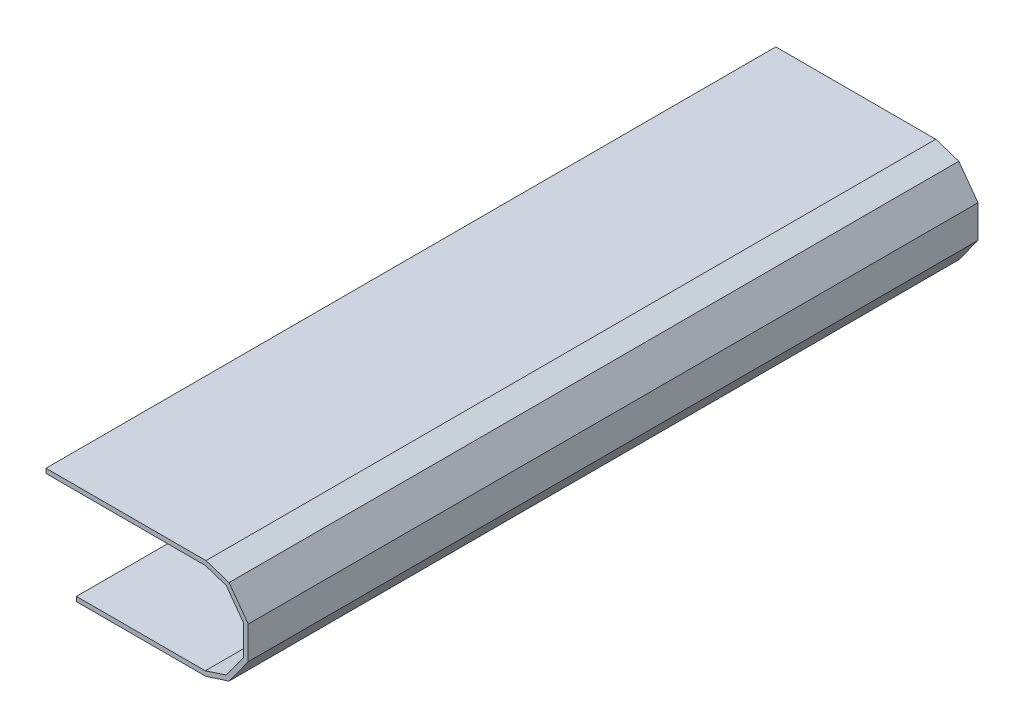
ISO-10303-21;
HEADER;
FILE_DESCRIPTION(('STEP AP214'),'2;1');
FILE_NAME('part.step','',(''),(''),'','','');
FILE_SCHEMA(('AUTOMOTIVE_DESIGN { 1 0 10303 214 1 1 1 1 }'));
ENDSEC;
DATA;
#1=APPLICATION_CONTEXT('core data for automotive mechanical design processes');
#2=APPLICATION_PROTOCOL_DEFINITION('international standard','automotive_design',2000,#1);
#3=PRODUCT_CONTEXT('',#1,'mechanical');
#4=PRODUCT('Part','Part','',(#3));
#5=PRODUCT_RELATED_PRODUCT_CATEGORY('part','',(#4));
#6=PRODUCT_DEFINITION_FORMATION('','',#4);
#7=PRODUCT_DEFINITION_CONTEXT('part definition',#1,'design');
#8=PRODUCT_DEFINITION('design','',#6,#7);
#9=PRODUCT_DEFINITION_SHAPE('','',#8);
#10=(LENGTH_UNIT() NAMED_UNIT(*) SI_UNIT(.MILLI.,.METRE.));
#11=(NAMED_UNIT(*) PLANE_ANGLE_UNIT() SI_UNIT($,.RADIAN.));
#12=(NAMED_UNIT(*) SI_UNIT($,.STERADIAN.) SOLID_ANGLE_UNIT());
#13=UNCERTAINTY_MEASURE_WITH_UNIT(LENGTH_MEASURE(1.E-05),#10,'distance_accuracy_value','');
#14=(GEOMETRIC_REPRESENTATION_CONTEXT(3) GLOBAL_UNCERTAINTY_ASSIGNED_CONTEXT((#13)) GLOBAL_UNIT_ASSIGNED_CONTEXT((#10,
#11,#12)) REPRESENTATION_CONTEXT('',''));
#15=CARTESIAN_POINT('',(0.,0.,0.));
#16=DIRECTION('',(0.,0.,1.));
#17=DIRECTION('',(1.,0.,0.));
#18=AXIS2_PLACEMENT_3D('',#15,#16,#17);
#19=CARTESIAN_POINT('',(-80.,-30.,480.));
#20=DIRECTION('',(1.,0.,0.));
#21=DIRECTION('',(0.,0.,-1.));
#22=AXIS2_PLACEMENT_3D('',#19,#20,#21);
#23=PLANE('',#22);
#24=DIRECTION('',(0.,-1.,0.));
#25=VECTOR('',#24,1.);
#26=CARTESIAN_POINT('',(-80.,-30.,0.));
#27=LINE('',#26,#25);
#28=CARTESIAN_POINT('',(-80.,-30.,0.));
#29=VERTEX_POINT('',#28);
#30=CARTESIAN_POINT('',(-80.,-33.,0.));
#31=VERTEX_POINT('',#30);
#32=EDGE_CURVE('E169',#29,#31,#27,.T.);
#33=ORIENTED_EDGE('',*,*,#32,.T.);
#34=DIRECTION('',(0.,0.,-1.));
#35=VECTOR('',#34,1.);
#36=CARTESIAN_POINT('',(-80.,-33.,480.));
#37=LINE('',#36,#35);
#38=CARTESIAN_POINT('',(-80.,-33.,480.));
#39=VERTEX_POINT('',#38);
#40=EDGE_CURVE('E11',#39,#31,#37,.T.);
#41=ORIENTED_EDGE('',*,*,#40,.F.);
#42=DIRECTION('',(0.,-1.,0.));
#43=VECTOR('',#42,1.);
#44=CARTESIAN_POINT('',(-80.,-30.,480.));
#45=LINE('',#44,#43);
#46=CARTESIAN_POINT('',(-80.,-30.,480.));
#47=VERTEX_POINT('',#46);
#48=EDGE_CURVE('E201',#47,#39,#45,.T.);
#49=ORIENTED_EDGE('',*,*,#48,.F.);
#50=DIRECTION('',(0.,0.,-1.));
#51=VECTOR('',#50,1.);
#52=CARTESIAN_POINT('',(-80.,-30.,480.));
#53=LINE('',#52,#51);
#54=EDGE_CURVE('E165',#47,#29,#53,.T.);
#55=ORIENTED_EDGE('',*,*,#54,.T.);
#56=EDGE_LOOP('',(#33,#41,#49,#55));
#57=FACE_BOUND('',#56,.T.);
#58=ADVANCED_FACE('F33',(#57),#23,.F.);
#59=CARTESIAN_POINT('',(0.,-33.,480.));
#60=DIRECTION('',(0.,1.,0.));
#61=DIRECTION('',(-1.,0.,0.));
#62=AXIS2_PLACEMENT_3D('',#59,#60,#61);
#63=PLANE('',#62);
#64=DIRECTION('',(1.,0.,0.));
#65=VECTOR('',#64,1.);
#66=CARTESIAN_POINT('',(0.,-33.,0.));
#67=LINE('',#66,#65);
#68=CARTESIAN_POINT('',(5.22668653071022,-32.9999999999999,0.));
#69=VERTEX_POINT('',#68);
#70=EDGE_CURVE('E172',#31,#69,#67,.T.);
#71=ORIENTED_EDGE('',*,*,#70,.T.);
#72=DIRECTION('',(0.,0.,-1.));
#73=VECTOR('',#72,1.);
#74=CARTESIAN_POINT('',(5.22668653071022,-32.9999999999999,480.));
#75=LINE('',#74,#73);
#76=CARTESIAN_POINT('',(5.22668653071022,-32.9999999999999,480.));
#77=VERTEX_POINT('',#76);
#78=EDGE_CURVE('E41',#77,#69,#75,.T.);
#79=ORIENTED_EDGE('',*,*,#78,.F.);
#80=DIRECTION('',(1.,0.,0.));
#81=VECTOR('',#80,1.);
#82=CARTESIAN_POINT('',(-80.,-33.,480.));
#83=LINE('',#82,#81);
#84=EDGE_CURVE('E109',#39,#77,#83,.T.);
#85=ORIENTED_EDGE('',*,*,#84,.F.);
#86=ORIENTED_EDGE('',*,*,#40,.T.);
#87=EDGE_LOOP('',(#71,#79,#85,#86));
#88=FACE_BOUND('',#87,.T.);
#89=ADVANCED_FACE('F330',(#88),#63,.F.);
#90=CARTESIAN_POINT('',(5.22668653071022,-32.9999999999999,480.));
#91=DIRECTION('',(-0.309016994374947,0.951056516295154,0.));
#92=DIRECTION('',(-0.951056516295154,-0.309016994374947,0.));
#93=AXIS2_PLACEMENT_3D('',#90,#91,#92);
#94=PLANE('',#93);
#95=DIRECTION('',(0.951056516295154,0.309016994374947,0.));
#96=VECTOR('',#95,1.);
#97=CARTESIAN_POINT('',(5.22668653071022,-32.9999999999999,0.));
#98=LINE('',#97,#96);
#99=CARTESIAN_POINT('',(20.3951216287466,-28.0714766756174,0.));
#100=VERTEX_POINT('',#99);
#101=EDGE_CURVE('E175',#69,#100,#98,.T.);
#102=ORIENTED_EDGE('',*,*,#101,.T.);
#103=DIRECTION('',(0.,0.,-1.));
#104=VECTOR('',#103,1.);
#105=CARTESIAN_POINT('',(20.3951216287466,-28.0714766756174,480.));
#106=LINE('',#105,#104);
#107=CARTESIAN_POINT('',(20.3951216287466,-28.0714766756174,480.));
#108=VERTEX_POINT('',#107);
#109=EDGE_CURVE('E226',#108,#100,#106,.T.);
#110=ORIENTED_EDGE('',*,*,#109,.F.);
#111=DIRECTION('',(0.951056516295154,0.309016994374947,0.));
#112=VECTOR('',#111,1.);
#113=CARTESIAN_POINT('',(5.22668653071022,-32.9999999999999,480.));
#114=LINE('',#113,#112);
#115=EDGE_CURVE('E234',#77,#108,#114,.T.);
#116=ORIENTED_EDGE('',*,*,#115,.F.);
#117=ORIENTED_EDGE('',*,*,#78,.T.);
#118=EDGE_LOOP('',(#102,#110,#116,#117));
#119=FACE_BOUND('',#118,.T.);
#120=ADVANCED_FACE('F232',(#119),#94,.F.);
#121=CARTESIAN_POINT('',(20.3951216287466,-28.0714766756174,480.));
#122=DIRECTION('',(-0.809016994374947,0.587785252292473,0.));
#123=DIRECTION('',(-0.587785252292473,-0.809016994374947,0.));
#124=AXIS2_PLACEMENT_3D('',#121,#122,#123);
#125=PLANE('',#124);
#126=DIRECTION('',(0.587785252292473,0.809016994374947,0.));
#127=VECTOR('',#126,1.);
#128=CARTESIAN_POINT('',(20.3951216287466,-28.0714766756174,0.));
#129=LINE('',#128,#127);
#130=CARTESIAN_POINT('',(33.0000000000001,-10.7223499756859,0.));
#131=VERTEX_POINT('',#130);
#132=EDGE_CURVE('E177',#100,#131,#129,.T.);
#133=ORIENTED_EDGE('',*,*,#132,.T.);
#134=DIRECTION('',(0.,0.,-1.));
#135=VECTOR('',#134,1.);
#136=CARTESIAN_POINT('',(33.0000000000001,-10.7223499756859,480.));
#137=LINE('',#136,#135);
#138=CARTESIAN_POINT('',(33.0000000000001,-10.7223499756859,480.));
#139=VERTEX_POINT('',#138);
#140=EDGE_CURVE('E223',#139,#131,#137,.T.);
#141=ORIENTED_EDGE('',*,*,#140,.F.);
#142=DIRECTION('',(0.587785252292473,0.809016994374947,0.));
#143=VECTOR('',#142,1.);
#144=CARTESIAN_POINT('',(20.3951216287466,-28.0714766756174,480.));
#145=LINE('',#144,#143);
#146=EDGE_CURVE('E250',#108,#139,#145,.T.);
#147=ORIENTED_EDGE('',*,*,#146,.F.);
#148=ORIENTED_EDGE('',*,*,#109,.T.);
#149=EDGE_LOOP('',(#133,#141,#147,#148));
#150=FACE_BOUND('',#149,.T.);
#151=ADVANCED_FACE('F241',(#150),#125,.F.);
#152=CARTESIAN_POINT('',(33.0000000000001,-10.7223499756859,480.));
#153=DIRECTION('',(-1.,0.,0.));
#154=DIRECTION('',(0.,0.,1.));
#155=AXIS2_PLACEMENT_3D('',#152,#153,#154);
#156=PLANE('',#155);
#157=DIRECTION('',(0.,1.,0.));
#158=VECTOR('',#157,1.);
#159=CARTESIAN_POINT('',(33.0000000000001,-10.7223499756859,0.));
#160=LINE('',#159,#158);
#161=CARTESIAN_POINT('',(33.0000000000001,10.7223499756859,0.));
#162=VERTEX_POINT('',#161);
#163=EDGE_CURVE('E179',#131,#162,#160,.T.);
#164=ORIENTED_EDGE('',*,*,#163,.T.);
#165=DIRECTION('',(0.,0.,-1.));
#166=VECTOR('',#165,1.);
#167=CARTESIAN_POINT('',(33.0000000000001,10.7223499756859,480.));
#168=LINE('',#167,#166);
#169=CARTESIAN_POINT('',(33.0000000000001,10.7223499756859,480.));
#170=VERTEX_POINT('',#169);
#171=EDGE_CURVE('E220',#170,#162,#168,.T.);
#172=ORIENTED_EDGE('',*,*,#171,.F.);
#173=DIRECTION('',(0.,1.,0.));
#174=VECTOR('',#173,1.);
#175=CARTESIAN_POINT('',(33.0000000000001,-10.7223499756859,480.));
#176=LINE('',#175,#174);
#177=EDGE_CURVE('E247',#139,#170,#176,.T.);
#178=ORIENTED_EDGE('',*,*,#177,.F.);
#179=ORIENTED_EDGE('',*,*,#140,.T.);
#180=EDGE_LOOP('',(#164,#172,#178,#179));
#181=FACE_BOUND('',#180,.T.);
#182=ADVANCED_FACE('F245',(#181),#156,.F.);
#183=CARTESIAN_POINT('',(33.0000000000001,10.7223499756859,480.));
#184=DIRECTION('',(-0.809016994374946,-0.587785252292475,0.));
#185=DIRECTION('',(0.587785252292475,-0.809016994374946,0.));
#186=AXIS2_PLACEMENT_3D('',#183,#184,#185);
#187=PLANE('',#186);
#188=DIRECTION('',(-0.587785252292475,0.809016994374946,0.));
#189=VECTOR('',#188,1.);
#190=CARTESIAN_POINT('',(33.0000000000001,10.7223499756859,0.));
#191=LINE('',#190,#189);
#192=CARTESIAN_POINT('',(20.3951216287466,28.0714766756174,0.));
#193=VERTEX_POINT('',#192);
#194=EDGE_CURVE('E181',#162,#193,#191,.T.);
#195=ORIENTED_EDGE('',*,*,#194,.T.);
#196=DIRECTION('',(0.,0.,-1.));
#197=VECTOR('',#196,1.);
#198=CARTESIAN_POINT('',(20.3951216287466,28.0714766756174,480.));
#199=LINE('',#198,#197);
#200=CARTESIAN_POINT('',(20.3951216287466,28.0714766756174,480.));
#201=VERTEX_POINT('',#200);
#202=EDGE_CURVE('E217',#201,#193,#199,.T.);
#203=ORIENTED_EDGE('',*,*,#202,.F.);
#204=DIRECTION('',(-0.587785252292475,0.809016994374946,0.));
#205=VECTOR('',#204,1.);
#206=CARTESIAN_POINT('',(33.0000000000001,10.7223499756859,480.));
#207=LINE('',#206,#205);
#208=EDGE_CURVE('E249',#170,#201,#207,.T.);
#209=ORIENTED_EDGE('',*,*,#208,.F.);
#210=ORIENTED_EDGE('',*,*,#171,.T.);
#211=EDGE_LOOP('',(#195,#203,#209,#210));
#212=FACE_BOUND('',#211,.T.);
#213=ADVANCED_FACE('F320',(#212),#187,.F.);
#214=CARTESIAN_POINT('',(20.3951216287466,28.0714766756174,480.));
#215=DIRECTION('',(-0.309016994374947,-0.951056516295154,0.));
#216=DIRECTION('',(0.951056516295154,-0.309016994374947,0.));
#217=AXIS2_PLACEMENT_3D('',#214,#215,#216);
#218=PLANE('',#217);
#219=DIRECTION('',(-0.951056516295154,0.309016994374947,0.));
#220=VECTOR('',#219,1.);
#221=CARTESIAN_POINT('',(20.3951216287466,28.0714766756174,0.));
#222=LINE('',#221,#220);
#223=CARTESIAN_POINT('',(5.22668653070951,33.0000000000001,0.));
#224=VERTEX_POINT('',#223);
#225=EDGE_CURVE('E183',#193,#224,#222,.T.);
#226=ORIENTED_EDGE('',*,*,#225,.T.);
#227=DIRECTION('',(0.,0.,-1.));
#228=VECTOR('',#227,1.);
#229=CARTESIAN_POINT('',(5.22668653070951,33.0000000000001,480.));
#230=LINE('',#229,#228);
#231=CARTESIAN_POINT('',(5.22668653070951,33.0000000000001,480.));
#232=VERTEX_POINT('',#231);
#233=EDGE_CURVE('E214',#232,#224,#230,.T.);
#234=ORIENTED_EDGE('',*,*,#233,.F.);
#235=DIRECTION('',(-0.951056516295154,0.309016994374947,0.));
#236=VECTOR('',#235,1.);
#237=CARTESIAN_POINT('',(20.3951216287466,28.0714766756174,480.));
#238=LINE('',#237,#236);
#239=EDGE_CURVE('E252',#201,#232,#238,.T.);
#240=ORIENTED_EDGE('',*,*,#239,.F.);
#241=ORIENTED_EDGE('',*,*,#202,.T.);
#242=EDGE_LOOP('',(#226,#234,#240,#241));
#243=FACE_BOUND('',#242,.T.);
#244=ADVANCED_FACE('F317',(#243),#218,.F.);
#245=CARTESIAN_POINT('',(0.,33.0000000000001,480.));
#246=DIRECTION('',(0.,-1.,0.));
#247=DIRECTION('',(0.,0.,-1.));
#248=AXIS2_PLACEMENT_3D('',#245,#246,#247);
#249=PLANE('',#248);
#250=DIRECTION('',(-1.,0.,0.));
#251=VECTOR('',#250,1.);
#252=CARTESIAN_POINT('',(0.,33.0000000000001,0.));
#253=LINE('',#252,#251);
#254=CARTESIAN_POINT('',(-100.,33.0000000000001,0.));
#255=VERTEX_POINT('',#254);
#256=EDGE_CURVE('E186',#224,#255,#253,.T.);
#257=ORIENTED_EDGE('',*,*,#256,.T.);
#258=DIRECTION('',(0.,0.,-1.));
#259=VECTOR('',#258,1.);
#260=CARTESIAN_POINT('',(-100.,33.0000000000001,0.));
#261=LINE('',#260,#259);
#262=CARTESIAN_POINT('',(-100.,33.0000000000001,480.));
#263=VERTEX_POINT('',#262);
#264=EDGE_CURVE('E173',#263,#255,#261,.T.);
#265=ORIENTED_EDGE('',*,*,#264,.F.);
#266=DIRECTION('',(-1.,0.,0.));
#267=VECTOR('',#266,1.);
#268=CARTESIAN_POINT('',(0.,33.0000000000001,480.));
#269=LINE('',#268,#267);
#270=EDGE_CURVE('E258',#232,#263,#269,.T.);
#271=ORIENTED_EDGE('',*,*,#270,.F.);
#272=ORIENTED_EDGE('',*,*,#233,.T.);
#273=EDGE_LOOP('',(#257,#265,#271,#272));
#274=FACE_BOUND('',#273,.T.);
#275=ADVANCED_FACE('F313',(#274),#249,.F.);
#276=CARTESIAN_POINT('',(0.,30.0000000000001,480.));
#277=DIRECTION('',(0.,1.,0.));
#278=DIRECTION('',(-1.,0.,0.));
#279=AXIS2_PLACEMENT_3D('',#276,#277,#278);
#280=PLANE('',#279);
#281=DIRECTION('',(1.,0.,0.));
#282=VECTOR('',#281,1.);
#283=CARTESIAN_POINT('',(0.,30.0000000000001,0.));
#284=LINE('',#283,#282);
#285=CARTESIAN_POINT('',(-100.,30.0000000000001,0.));
#286=VERTEX_POINT('',#285);
#287=CARTESIAN_POINT('',(4.7515332097361,30.,0.));
#288=VERTEX_POINT('',#287);
#289=EDGE_CURVE('E189',#286,#288,#284,.T.);
#290=ORIENTED_EDGE('',*,*,#289,.T.);
#291=DIRECTION('',(0.,0.,-1.));
#292=VECTOR('',#291,1.);
#293=CARTESIAN_POINT('',(4.7515332097361,30.,480.));
#294=LINE('',#293,#292);
#295=CARTESIAN_POINT('',(4.7515332097361,30.,480.));
#296=VERTEX_POINT('',#295);
#297=EDGE_CURVE('E211',#296,#288,#294,.T.);
#298=ORIENTED_EDGE('',*,*,#297,.F.);
#299=DIRECTION('',(1.,0.,0.));
#300=VECTOR('',#299,1.);
#301=CARTESIAN_POINT('',(0.,30.0000000000001,480.));
#302=LINE('',#301,#300);
#303=CARTESIAN_POINT('',(-100.,30.0000000000001,480.));
#304=VERTEX_POINT('',#303);
#305=EDGE_CURVE('E261',#304,#296,#302,.T.);
#306=ORIENTED_EDGE('',*,*,#305,.F.);
#307=DIRECTION('',(0.,0.,1.));
#308=VECTOR('',#307,1.);
#309=CARTESIAN_POINT('',(-100.,30.0000000000001,0.));
#310=LINE('',#309,#308);
#311=EDGE_CURVE('E288',#286,#304,#310,.T.);
#312=ORIENTED_EDGE('',*,*,#311,.F.);
#313=EDGE_LOOP('',(#290,#298,#306,#312));
#314=FACE_BOUND('',#313,.T.);
#315=ADVANCED_FACE('F312',(#314),#280,.F.);
#316=CARTESIAN_POINT('',(18.5410196624969,25.5195242505612,480.));
#317=DIRECTION('',(0.309016994374947,0.951056516295154,0.));
#318=DIRECTION('',(-0.951056516295154,0.309016994374947,0.));
#319=AXIS2_PLACEMENT_3D('',#316,#317,#318);
#320=PLANE('',#319);
#321=DIRECTION('',(0.951056516295154,-0.309016994374947,0.));
#322=VECTOR('',#321,1.);
#323=CARTESIAN_POINT('',(18.5410196624969,25.5195242505612,0.));
#324=LINE('',#323,#322);
#325=CARTESIAN_POINT('',(18.5410196624969,25.5195242505612,0.));
#326=VERTEX_POINT('',#325);
#327=EDGE_CURVE('E191',#288,#326,#324,.T.);
#328=ORIENTED_EDGE('',*,*,#327,.T.);
#329=DIRECTION('',(0.,0.,-1.));
#330=VECTOR('',#329,1.);
#331=CARTESIAN_POINT('',(18.5410196624969,25.5195242505612,480.));
#332=LINE('',#331,#330);
#333=CARTESIAN_POINT('',(18.5410196624969,25.5195242505612,480.));
#334=VERTEX_POINT('',#333);
#335=EDGE_CURVE('E208',#334,#326,#332,.T.);
#336=ORIENTED_EDGE('',*,*,#335,.F.);
#337=DIRECTION('',(0.951056516295154,-0.309016994374947,0.));
#338=VECTOR('',#337,1.);
#339=CARTESIAN_POINT('',(18.5410196624969,25.5195242505612,480.));
#340=LINE('',#339,#338);
#341=EDGE_CURVE('E263',#296,#334,#340,.T.);
#342=ORIENTED_EDGE('',*,*,#341,.F.);
#343=ORIENTED_EDGE('',*,*,#297,.T.);
#344=EDGE_LOOP('',(#328,#336,#342,#343));
#345=FACE_BOUND('',#344,.T.);
#346=ADVANCED_FACE('F365',(#345),#320,.F.);
#347=CARTESIAN_POINT('',(30.0000000000001,9.74759088698721,480.));
#348=DIRECTION('',(0.809016994374946,0.587785252292475,0.));
#349=DIRECTION('',(-0.587785252292475,0.809016994374946,0.));
#350=AXIS2_PLACEMENT_3D('',#347,#348,#349);
#351=PLANE('',#350);
#352=DIRECTION('',(0.587785252292475,-0.809016994374946,0.));
#353=VECTOR('',#352,1.);
#354=CARTESIAN_POINT('',(30.0000000000001,9.74759088698721,0.));
#355=LINE('',#354,#353);
#356=CARTESIAN_POINT('',(30.0000000000001,9.74759088698721,0.));
#357=VERTEX_POINT('',#356);
#358=EDGE_CURVE('E193',#326,#357,#355,.T.);
#359=ORIENTED_EDGE('',*,*,#358,.T.);
#360=DIRECTION('',(0.,0.,-1.));
#361=VECTOR('',#360,1.);
#362=CARTESIAN_POINT('',(30.0000000000001,9.74759088698721,480.));
#363=LINE('',#362,#361);
#364=CARTESIAN_POINT('',(30.0000000000001,9.74759088698721,480.));
#365=VERTEX_POINT('',#364);
#366=EDGE_CURVE('E205',#365,#357,#363,.T.);
#367=ORIENTED_EDGE('',*,*,#366,.F.);
#368=DIRECTION('',(0.587785252292475,-0.809016994374946,0.));
#369=VECTOR('',#368,1.);
#370=CARTESIAN_POINT('',(30.0000000000001,9.74759088698721,480.));
#371=LINE('',#370,#369);
#372=EDGE_CURVE('E265',#334,#365,#371,.T.);
#373=ORIENTED_EDGE('',*,*,#372,.F.);
#374=ORIENTED_EDGE('',*,*,#335,.T.);
#375=EDGE_LOOP('',(#359,#367,#373,#374));
#376=FACE_BOUND('',#375,.T.);
#377=ADVANCED_FACE('F271',(#376),#351,.F.);
#378=CARTESIAN_POINT('',(30.0000000000001,-9.74759088698722,480.));
#379=DIRECTION('',(1.,0.,0.));
#380=DIRECTION('',(0.,1.,0.));
#381=AXIS2_PLACEMENT_3D('',#378,#379,#380);
#382=PLANE('',#381);
#383=DIRECTION('',(0.,-1.,0.));
#384=VECTOR('',#383,1.);
#385=CARTESIAN_POINT('',(30.0000000000001,-9.74759088698722,0.));
#386=LINE('',#385,#384);
#387=CARTESIAN_POINT('',(30.0000000000001,-9.74759088698722,0.));
#388=VERTEX_POINT('',#387);
#389=EDGE_CURVE('E195',#357,#388,#386,.T.);
#390=ORIENTED_EDGE('',*,*,#389,.T.);
#391=DIRECTION('',(0.,0.,-1.));
#392=VECTOR('',#391,1.);
#393=CARTESIAN_POINT('',(30.0000000000001,-9.74759088698722,480.));
#394=LINE('',#393,#392);
#395=CARTESIAN_POINT('',(30.0000000000001,-9.74759088698722,480.));
#396=VERTEX_POINT('',#395);
#397=EDGE_CURVE('E160',#396,#388,#394,.T.);
#398=ORIENTED_EDGE('',*,*,#397,.F.);
#399=DIRECTION('',(0.,-1.,0.));
#400=VECTOR('',#399,1.);
#401=CARTESIAN_POINT('',(30.0000000000001,-9.74759088698722,480.));
#402=LINE('',#401,#400);
#403=EDGE_CURVE('E149',#365,#396,#402,.T.);
#404=ORIENTED_EDGE('',*,*,#403,.F.);
#405=ORIENTED_EDGE('',*,*,#366,.T.);
#406=EDGE_LOOP('',(#390,#398,#404,#405));
#407=FACE_BOUND('',#406,.T.);
#408=ADVANCED_FACE('F275',(#407),#382,.F.);
#409=CARTESIAN_POINT('',(18.5410196624969,-25.5195242505613,480.));
#410=DIRECTION('',(0.809016994374947,-0.587785252292473,0.));
#411=DIRECTION('',(0.587785252292473,0.809016994374947,0.));
#412=AXIS2_PLACEMENT_3D('',#409,#410,#411);
#413=PLANE('',#412);
#414=DIRECTION('',(-0.587785252292473,-0.809016994374947,0.));
#415=VECTOR('',#414,1.);
#416=CARTESIAN_POINT('',(18.5410196624969,-25.5195242505613,0.));
#417=LINE('',#416,#415);
#418=CARTESIAN_POINT('',(18.5410196624969,-25.5195242505613,0.));
#419=VERTEX_POINT('',#418);
#420=EDGE_CURVE('E158',#388,#419,#417,.T.);
#421=ORIENTED_EDGE('',*,*,#420,.T.);
#422=DIRECTION('',(0.,0.,-1.));
#423=VECTOR('',#422,1.);
#424=CARTESIAN_POINT('',(18.5410196624969,-25.5195242505613,480.));
#425=LINE('',#424,#423);
#426=CARTESIAN_POINT('',(18.5410196624969,-25.5195242505613,480.));
#427=VERTEX_POINT('',#426);
#428=EDGE_CURVE('E155',#427,#419,#425,.T.);
#429=ORIENTED_EDGE('',*,*,#428,.F.);
#430=DIRECTION('',(-0.587785252292473,-0.809016994374947,0.));
#431=VECTOR('',#430,1.);
#432=CARTESIAN_POINT('',(18.5410196624969,-25.5195242505613,480.));
#433=LINE('',#432,#431);
#434=EDGE_CURVE('E142',#396,#427,#433,.T.);
#435=ORIENTED_EDGE('',*,*,#434,.F.);
#436=ORIENTED_EDGE('',*,*,#397,.T.);
#437=EDGE_LOOP('',(#421,#429,#435,#436));
#438=FACE_BOUND('',#437,.T.);
#439=ADVANCED_FACE('F156',(#438),#413,.F.);
#440=CARTESIAN_POINT('',(4.75153320973662,-29.9999999999999,480.));
#441=DIRECTION('',(0.309016994374947,-0.951056516295154,0.));
#442=DIRECTION('',(0.951056516295154,0.309016994374947,0.));
#443=AXIS2_PLACEMENT_3D('',#440,#441,#442);
#444=PLANE('',#443);
#445=DIRECTION('',(-0.951056516295154,-0.309016994374947,0.));
#446=VECTOR('',#445,1.);
#447=CARTESIAN_POINT('',(4.75153320973662,-29.9999999999999,0.));
#448=LINE('',#447,#446);
#449=CARTESIAN_POINT('',(4.75153320973662,-29.9999999999999,0.));
#450=VERTEX_POINT('',#449);
#451=EDGE_CURVE('E198',#419,#450,#448,.T.);
#452=ORIENTED_EDGE('',*,*,#451,.T.);
#453=DIRECTION('',(0.,0.,-1.));
#454=VECTOR('',#453,1.);
#455=CARTESIAN_POINT('',(4.75153320973662,-29.9999999999999,480.));
#456=LINE('',#455,#454);
#457=CARTESIAN_POINT('',(4.75153320973662,-29.9999999999999,480.));
#458=VERTEX_POINT('',#457);
#459=EDGE_CURVE('E161',#458,#450,#456,.T.);
#460=ORIENTED_EDGE('',*,*,#459,.F.);
#461=DIRECTION('',(-0.951056516295154,-0.309016994374947,0.));
#462=VECTOR('',#461,1.);
#463=CARTESIAN_POINT('',(4.75153320973662,-29.9999999999999,480.));
#464=LINE('',#463,#462);
#465=EDGE_CURVE('E146',#427,#458,#464,.T.);
#466=ORIENTED_EDGE('',*,*,#465,.F.);
#467=ORIENTED_EDGE('',*,*,#428,.T.);
#468=EDGE_LOOP('',(#452,#460,#466,#467));
#469=FACE_BOUND('',#468,.T.);
#470=ADVANCED_FACE('F163',(#469),#444,.F.);
#471=CARTESIAN_POINT('',(-80.,-30.,480.));
#472=DIRECTION('',(0.,-1.,0.));
#473=DIRECTION('',(1.,0.,0.));
#474=AXIS2_PLACEMENT_3D('',#471,#472,#473);
#475=PLANE('',#474);
#476=DIRECTION('',(-1.,0.,0.));
#477=VECTOR('',#476,1.);
#478=CARTESIAN_POINT('',(-80.,-30.,0.));
#479=LINE('',#478,#477);
#480=EDGE_CURVE('E97',#450,#29,#479,.T.);
#481=ORIENTED_EDGE('',*,*,#480,.T.);
#482=ORIENTED_EDGE('',*,*,#54,.F.);
#483=DIRECTION('',(-1.,0.,0.));
#484=VECTOR('',#483,1.);
#485=CARTESIAN_POINT('',(0.,-29.9999999999999,480.));
#486=LINE('',#485,#484);
#487=EDGE_CURVE('E49',#458,#47,#486,.T.);
#488=ORIENTED_EDGE('',*,*,#487,.F.);
#489=ORIENTED_EDGE('',*,*,#459,.T.);
#490=EDGE_LOOP('',(#481,#482,#488,#489));
#491=FACE_BOUND('',#490,.T.);
#492=ADVANCED_FACE('F276',(#491),#475,.F.);
#493=CARTESIAN_POINT('',(0.,0.,480.));
#494=DIRECTION('',(0.,0.,1.));
#495=DIRECTION('',(1.,0.,0.));
#496=AXIS2_PLACEMENT_3D('',#493,#494,#495);
#497=PLANE('',#496);
#498=ORIENTED_EDGE('',*,*,#48,.T.);
#499=ORIENTED_EDGE('',*,*,#84,.T.);
#500=ORIENTED_EDGE('',*,*,#115,.T.);
#501=ORIENTED_EDGE('',*,*,#146,.T.);
#502=ORIENTED_EDGE('',*,*,#177,.T.);
#503=ORIENTED_EDGE('',*,*,#208,.T.);
#504=ORIENTED_EDGE('',*,*,#239,.T.);
#505=ORIENTED_EDGE('',*,*,#270,.T.);
#506=DIRECTION('',(0.,1.,0.));
#507=VECTOR('',#506,1.);
#508=CARTESIAN_POINT('',(-100.,30.0000000000001,480.));
#509=LINE('',#508,#507);
#510=EDGE_CURVE('E285',#304,#263,#509,.T.);
#511=ORIENTED_EDGE('',*,*,#510,.F.);
#512=ORIENTED_EDGE('',*,*,#305,.T.);
#513=ORIENTED_EDGE('',*,*,#341,.T.);
#514=ORIENTED_EDGE('',*,*,#372,.T.);
#515=ORIENTED_EDGE('',*,*,#403,.T.);
#516=ORIENTED_EDGE('',*,*,#434,.T.);
#517=ORIENTED_EDGE('',*,*,#465,.T.);
#518=ORIENTED_EDGE('',*,*,#487,.T.);
#519=EDGE_LOOP('',(#498,#499,#500,#501,#502,#503,#504,#505,#511,#512,#513,#514,#515,#516,#517,#518));
#520=FACE_BOUND('',#519,.T.);
#521=ADVANCED_FACE('F144',(#520),#497,.T.);
#522=CARTESIAN_POINT('',(0.,0.,0.));
#523=DIRECTION('',(0.,0.,1.));
#524=DIRECTION('',(1.,0.,0.));
#525=AXIS2_PLACEMENT_3D('',#522,#523,#524);
#526=PLANE('',#525);
#527=ORIENTED_EDGE('',*,*,#32,.F.);
#528=ORIENTED_EDGE('',*,*,#480,.F.);
#529=ORIENTED_EDGE('',*,*,#451,.F.);
#530=ORIENTED_EDGE('',*,*,#420,.F.);
#531=ORIENTED_EDGE('',*,*,#389,.F.);
#532=ORIENTED_EDGE('',*,*,#358,.F.);
#533=ORIENTED_EDGE('',*,*,#327,.F.);
#534=ORIENTED_EDGE('',*,*,#289,.F.);
#535=DIRECTION('',(0.,-1.,0.));
#536=VECTOR('',#535,1.);
#537=CARTESIAN_POINT('',(-100.,30.0000000000001,0.));
#538=LINE('',#537,#536);
#539=EDGE_CURVE('E291',#255,#286,#538,.T.);
#540=ORIENTED_EDGE('',*,*,#539,.F.);
#541=ORIENTED_EDGE('',*,*,#256,.F.);
#542=ORIENTED_EDGE('',*,*,#225,.F.);
#543=ORIENTED_EDGE('',*,*,#194,.F.);
#544=ORIENTED_EDGE('',*,*,#163,.F.);
#545=ORIENTED_EDGE('',*,*,#132,.F.);
#546=ORIENTED_EDGE('',*,*,#101,.F.);
#547=ORIENTED_EDGE('',*,*,#70,.F.);
#548=EDGE_LOOP('',(#527,#528,#529,#530,#531,#532,#533,#534,#540,#541,#542,#543,#544,#545,#546,#547));
#549=FACE_BOUND('',#548,.T.);
#550=ADVANCED_FACE('F236',(#549),#526,.F.);
#551=CARTESIAN_POINT('',(-100.,0.,0.));
#552=DIRECTION('',(1.,0.,0.));
#553=DIRECTION('',(0.,0.,-1.));
#554=AXIS2_PLACEMENT_3D('',#551,#552,#553);
#555=PLANE('',#554);
#556=ORIENTED_EDGE('',*,*,#539,.T.);
#557=ORIENTED_EDGE('',*,*,#311,.T.);
#558=ORIENTED_EDGE('',*,*,#510,.T.);
#559=ORIENTED_EDGE('',*,*,#264,.T.);
#560=EDGE_LOOP('',(#556,#557,#558,#559));
#561=FACE_BOUND('',#560,.T.);
#562=ADVANCED_FACE('F296',(#561),#555,.F.);
#563=CLOSED_SHELL('',(#58,#89,#120,#151,#182,#213,#244,#275,#315,#346,#377,#408,#439,#470,#492,
#521,#550,#562));
#564=MANIFOLD_SOLID_BREP('B2',#563);
#565=ADVANCED_BREP_SHAPE_REPRESENTATION('',(#18,#564),#14);
#566=SHAPE_DEFINITION_REPRESENTATION(#9,#565);
ENDSEC;
END-ISO-10303-21;
